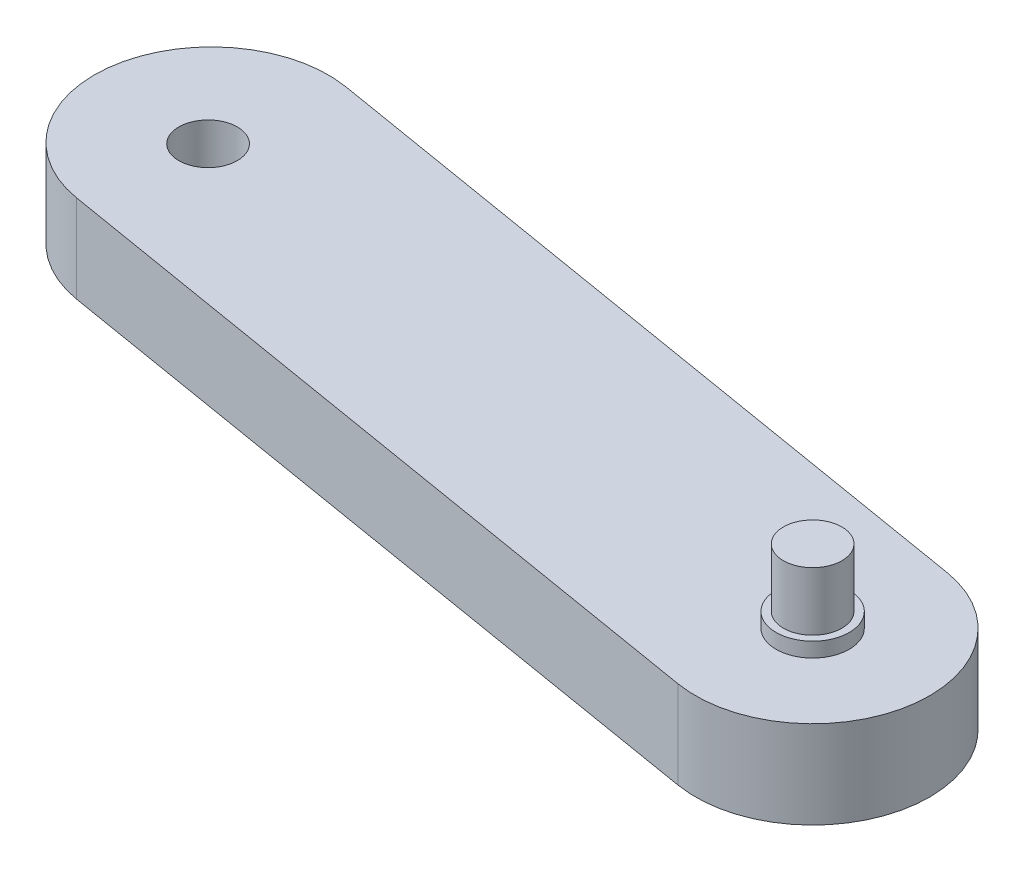
ISO-10303-21;
HEADER;
FILE_DESCRIPTION(('STEP AP214'),'2;1');
FILE_NAME('part.step','',(''),(''),'','','');
FILE_SCHEMA(('AUTOMOTIVE_DESIGN { 1 0 10303 214 1 1 1 1 }'));
ENDSEC;
DATA;
#1=APPLICATION_CONTEXT('core data for automotive mechanical design processes');
#2=APPLICATION_PROTOCOL_DEFINITION('international standard','automotive_design',2000,#1);
#3=PRODUCT_CONTEXT('',#1,'mechanical');
#4=PRODUCT('Part','Part','',(#3));
#5=PRODUCT_RELATED_PRODUCT_CATEGORY('part','',(#4));
#6=PRODUCT_DEFINITION_FORMATION('','',#4);
#7=PRODUCT_DEFINITION_CONTEXT('part definition',#1,'design');
#8=PRODUCT_DEFINITION('design','',#6,#7);
#9=PRODUCT_DEFINITION_SHAPE('','',#8);
#10=(LENGTH_UNIT() NAMED_UNIT(*) SI_UNIT(.MILLI.,.METRE.));
#11=(NAMED_UNIT(*) PLANE_ANGLE_UNIT() SI_UNIT($,.RADIAN.));
#12=(NAMED_UNIT(*) SI_UNIT($,.STERADIAN.) SOLID_ANGLE_UNIT());
#13=UNCERTAINTY_MEASURE_WITH_UNIT(LENGTH_MEASURE(1.E-05),#10,'distance_accuracy_value','');
#14=(GEOMETRIC_REPRESENTATION_CONTEXT(3) GLOBAL_UNCERTAINTY_ASSIGNED_CONTEXT((#13)) GLOBAL_UNIT_ASSIGNED_CONTEXT((#10,
#11,#12)) REPRESENTATION_CONTEXT('',''));
#15=CARTESIAN_POINT('',(0.,0.,0.));
#16=DIRECTION('',(0.,0.,1.));
#17=DIRECTION('',(1.,0.,0.));
#18=AXIS2_PLACEMENT_3D('',#15,#16,#17);
#19=CARTESIAN_POINT('',(49.660593642251,-4.99999999999475,15.1054988992519));
#20=DIRECTION('',(0.,-1.,-8.40308555279392E-13));
#21=DIRECTION('',(0.986423745690054,-1.21441128209191E-13,0.164219955970046));
#22=AXIS2_PLACEMENT_3D('',#19,#20,#21);
#23=CYLINDRICAL_SURFACE('',#22,2.49999999999999);
#24=CARTESIAN_POINT('',(49.6605936422511,-9.99999999999475,15.1054988992477));
#25=DIRECTION('',(0.,-1.,-8.40308555279392E-13));
#26=DIRECTION('',(0.986423745690054,-1.21441128209191E-13,0.164219955970046));
#27=AXIS2_PLACEMENT_3D('',#24,#25,#26);
#28=CIRCLE('',#27,2.49999999999999);
#29=CARTESIAN_POINT('',(52.1266530064762,-9.99999999999506,15.5160487891728));
#30=VERTEX_POINT('',#29);
#31=EDGE_CURVE('E11',#30,#30,#28,.F.);
#32=ORIENTED_EDGE('',*,*,#31,.T.);
#33=EDGE_LOOP('',(#32));
#34=FACE_BOUND('',#33,.T.);
#35=CARTESIAN_POINT('',(49.6605936422511,-8.99999999999475,15.1054988992485));
#36=DIRECTION('',(0.,1.,8.40308555279392E-13));
#37=DIRECTION('',(-0.164219955970046,-8.3168517060016E-13,0.986423745690054));
#38=AXIS2_PLACEMENT_3D('',#35,#36,#37);
#39=CIRCLE('',#38,2.49999999999999);
#40=CARTESIAN_POINT('',(49.250043752326,-8.99999999999683,17.5715582634736));
#41=VERTEX_POINT('',#40);
#42=EDGE_CURVE('E111',#41,#41,#39,.T.);
#43=ORIENTED_EDGE('',*,*,#42,.F.);
#44=EDGE_LOOP('',(#43));
#45=FACE_BOUND('',#44,.T.);
#46=ADVANCED_FACE('F42',(#34,#45),#23,.T.);
#47=CARTESIAN_POINT('',(-0.974353290011899,-15.9999999999953,14.7858910662608));
#48=DIRECTION('',(-0.164219955970046,-8.3168517060016E-13,0.986423745690054));
#49=DIRECTION('',(0.,-1.,-8.40308555279392E-13));
#50=AXIS2_PLACEMENT_3D('',#47,#48,#49);
#51=PLANE('',#50);
#52=DIRECTION('',(0.986423745690054,-1.21441128209191E-13,0.164219955970046));
#53=VECTOR('',#52,1.);
#54=CARTESIAN_POINT('',(-0.974353290011999,-9.99999999999534,14.7858910662658));
#55=LINE('',#54,#53);
#56=CARTESIAN_POINT('',(-0.974353290011999,-9.99999999999534,14.7858910662658));
#57=VERTEX_POINT('',#56);
#58=CARTESIAN_POINT('',(48.3468339944907,-10.0000000000014,22.9968888647681));
#59=VERTEX_POINT('',#58);
#60=EDGE_CURVE('E109',#57,#59,#55,.T.);
#61=ORIENTED_EDGE('',*,*,#60,.F.);
#62=DIRECTION('',(0.,1.,8.40308555279392E-13));
#63=VECTOR('',#62,1.);
#64=CARTESIAN_POINT('',(-0.974353290011899,-15.9999999999953,14.7858910662608));
#65=LINE('',#64,#63);
#66=CARTESIAN_POINT('',(-0.974353290011899,-15.9999999999953,14.7858910662608));
#67=VERTEX_POINT('',#66);
#68=EDGE_CURVE('E51',#67,#57,#65,.T.);
#69=ORIENTED_EDGE('',*,*,#68,.F.);
#70=DIRECTION('',(0.986423745690054,-1.21441128209191E-13,0.164219955970046));
#71=VECTOR('',#70,1.);
#72=CARTESIAN_POINT('',(-0.974353290011899,-15.9999999999953,14.7858910662608));
#73=LINE('',#72,#71);
#74=CARTESIAN_POINT('',(48.3468339944908,-16.0000000000014,22.9968888647631));
#75=VERTEX_POINT('',#74);
#76=EDGE_CURVE('E92',#67,#75,#73,.T.);
#77=ORIENTED_EDGE('',*,*,#76,.T.);
#78=DIRECTION('',(0.,1.,8.40308555279392E-13));
#79=VECTOR('',#78,1.);
#80=CARTESIAN_POINT('',(48.3468339944908,-16.0000000000014,22.9968888647631));
#81=LINE('',#80,#79);
#82=EDGE_CURVE('E59',#75,#59,#81,.T.);
#83=ORIENTED_EDGE('',*,*,#82,.T.);
#84=EDGE_LOOP('',(#61,#69,#77,#83));
#85=FACE_BOUND('',#84,.T.);
#86=ADVANCED_FACE('F44',(#85),#51,.T.);
#87=CARTESIAN_POINT('',(0.339406357748471,-15.9999999999887,6.89450110074033));
#88=DIRECTION('',(0.,1.,8.40308555279392E-13));
#89=DIRECTION('',(-0.986423745690054,1.21441128209191E-13,-0.164219955970046));
#90=AXIS2_PLACEMENT_3D('',#87,#88,#89);
#91=CYLINDRICAL_SURFACE('',#90,8.);
#92=CARTESIAN_POINT('',(0.33940635774837,-9.99999999998868,6.89450110074537));
#93=DIRECTION('',(0.,-1.,-8.40308555279392E-13));
#94=DIRECTION('',(0.986423745690054,-1.21441128209191E-13,0.164219955970046));
#95=AXIS2_PLACEMENT_3D('',#92,#93,#94);
#96=CIRCLE('',#95,8.);
#97=CARTESIAN_POINT('',(1.65316600550874,-9.99999999998203,-0.996888864775062));
#98=VERTEX_POINT('',#97);
#99=EDGE_CURVE('E99',#57,#98,#96,.T.);
#100=ORIENTED_EDGE('',*,*,#99,.T.);
#101=DIRECTION('',(0.,1.,8.40308555279392E-13));
#102=VECTOR('',#101,1.);
#103=CARTESIAN_POINT('',(1.65316600550884,-15.999999999982,-0.9968888647801));
#104=LINE('',#103,#102);
#105=CARTESIAN_POINT('',(1.65316600550884,-15.999999999982,-0.9968888647801));
#106=VERTEX_POINT('',#105);
#107=EDGE_CURVE('E96',#106,#98,#104,.T.);
#108=ORIENTED_EDGE('',*,*,#107,.F.);
#109=CARTESIAN_POINT('',(0.339406357748471,-15.9999999999887,6.89450110074033));
#110=DIRECTION('',(0.,-1.,-8.40308555279392E-13));
#111=DIRECTION('',(0.986423745690054,-1.21441128209191E-13,0.164219955970046));
#112=AXIS2_PLACEMENT_3D('',#109,#110,#111);
#113=CIRCLE('',#112,8.);
#114=EDGE_CURVE('E86',#67,#106,#113,.T.);
#115=ORIENTED_EDGE('',*,*,#114,.F.);
#116=ORIENTED_EDGE('',*,*,#68,.T.);
#117=EDGE_LOOP('',(#100,#108,#115,#116));
#118=FACE_BOUND('',#117,.T.);
#119=ADVANCED_FACE('F97',(#118),#91,.T.);
#120=CARTESIAN_POINT('',(1.65316600550884,-15.999999999982,-0.9968888647801));
#121=DIRECTION('',(-0.164219955970046,-8.3168517060016E-13,0.986423745690054));
#122=DIRECTION('',(0.,-1.,-8.40308555279392E-13));
#123=AXIS2_PLACEMENT_3D('',#120,#121,#122);
#124=PLANE('',#123);
#125=DIRECTION('',(0.986423745690054,-1.21441128209191E-13,0.164219955970046));
#126=VECTOR('',#125,1.);
#127=CARTESIAN_POINT('',(1.65316600550874,-9.99999999998203,-0.996888864775062));
#128=LINE('',#127,#126);
#129=CARTESIAN_POINT('',(50.9743532900115,-9.9999999999881,7.21410893372725));
#130=VERTEX_POINT('',#129);
#131=EDGE_CURVE('E113',#98,#130,#128,.T.);
#132=ORIENTED_EDGE('',*,*,#131,.T.);
#133=DIRECTION('',(0.,1.,8.40308555279392E-13));
#134=VECTOR('',#133,1.);
#135=CARTESIAN_POINT('',(50.9743532900116,-15.9999999999881,7.2141089337222));
#136=LINE('',#135,#134);
#137=CARTESIAN_POINT('',(50.9743532900116,-15.9999999999881,7.2141089337222));
#138=VERTEX_POINT('',#137);
#139=EDGE_CURVE('E74',#138,#130,#136,.T.);
#140=ORIENTED_EDGE('',*,*,#139,.F.);
#141=DIRECTION('',(0.986423745690054,-1.21441128209191E-13,0.164219955970046));
#142=VECTOR('',#141,1.);
#143=CARTESIAN_POINT('',(1.65316600550884,-15.999999999982,-0.9968888647801));
#144=LINE('',#143,#142);
#145=EDGE_CURVE('E91',#106,#138,#144,.T.);
#146=ORIENTED_EDGE('',*,*,#145,.F.);
#147=ORIENTED_EDGE('',*,*,#107,.T.);
#148=EDGE_LOOP('',(#132,#140,#146,#147));
#149=FACE_BOUND('',#148,.T.);
#150=ADVANCED_FACE('F103',(#149),#124,.F.);
#151=CARTESIAN_POINT('',(49.6605936422512,-15.9999999999948,15.1054988992426));
#152=DIRECTION('',(0.,1.,8.40308555279392E-13));
#153=DIRECTION('',(-0.986423745690054,1.21441128209191E-13,-0.164219955970046));
#154=AXIS2_PLACEMENT_3D('',#151,#152,#153);
#155=CYLINDRICAL_SURFACE('',#154,8.);
#156=CARTESIAN_POINT('',(49.6605936422511,-9.99999999999475,15.1054988992477));
#157=DIRECTION('',(0.,-1.,-8.40308555279392E-13));
#158=DIRECTION('',(0.986423745690054,-1.21441128209191E-13,0.164219955970046));
#159=AXIS2_PLACEMENT_3D('',#156,#157,#158);
#160=CIRCLE('',#159,8.);
#161=EDGE_CURVE('E115',#59,#130,#160,.F.);
#162=ORIENTED_EDGE('',*,*,#161,.F.);
#163=ORIENTED_EDGE('',*,*,#82,.F.);
#164=CARTESIAN_POINT('',(49.6605936422512,-15.9999999999948,15.1054988992426));
#165=DIRECTION('',(0.,-1.,-8.40308555279392E-13));
#166=DIRECTION('',(0.986423745690054,-1.21441128209191E-13,0.164219955970046));
#167=AXIS2_PLACEMENT_3D('',#164,#165,#166);
#168=CIRCLE('',#167,8.);
#169=EDGE_CURVE('E104',#75,#138,#168,.F.);
#170=ORIENTED_EDGE('',*,*,#169,.T.);
#171=ORIENTED_EDGE('',*,*,#139,.T.);
#172=EDGE_LOOP('',(#162,#163,#170,#171));
#173=FACE_BOUND('',#172,.T.);
#174=ADVANCED_FACE('F137',(#173),#155,.T.);
#175=CARTESIAN_POINT('',(0.339406357748471,-15.9999999999887,6.89450110074033));
#176=DIRECTION('',(0.,-1.,-8.40308555279392E-13));
#177=DIRECTION('',(0.986423745690054,-1.21441128209191E-13,0.164219955970046));
#178=AXIS2_PLACEMENT_3D('',#175,#176,#177);
#179=PLANE('',#178);
#180=CARTESIAN_POINT('',(0.307919561144055,-15.9999999999888,7.08832981948345));
#181=DIRECTION('',(0.,-1.,-8.40308555279392E-13));
#182=DIRECTION('',(0.156466807220186,8.32613400229528E-13,-0.987683217554253));
#183=AXIS2_PLACEMENT_3D('',#180,#181,#182);
#184=CIRCLE('',#183,2.);
#185=CARTESIAN_POINT('',(0.620853175584427,-15.9999999999872,5.11296338437494));
#186=VERTEX_POINT('',#185);
#187=EDGE_CURVE('E223',#186,#186,#184,.T.);
#188=ORIENTED_EDGE('',*,*,#187,.F.);
#189=EDGE_LOOP('',(#188));
#190=FACE_BOUND('',#189,.T.);
#191=ORIENTED_EDGE('',*,*,#76,.F.);
#192=ORIENTED_EDGE('',*,*,#114,.T.);
#193=ORIENTED_EDGE('',*,*,#145,.T.);
#194=ORIENTED_EDGE('',*,*,#169,.F.);
#195=EDGE_LOOP('',(#191,#192,#193,#194));
#196=FACE_BOUND('',#195,.T.);
#197=ADVANCED_FACE('F88',(#190,#196),#179,.T.);
#198=CARTESIAN_POINT('',(0.33940635774837,-9.99999999998868,6.89450110074537));
#199=DIRECTION('',(0.,-1.,-8.40308555279392E-13));
#200=DIRECTION('',(0.986423745690054,-1.21441128209191E-13,0.164219955970046));
#201=AXIS2_PLACEMENT_3D('',#198,#199,#200);
#202=PLANE('',#201);
#203=CARTESIAN_POINT('',(0.307919561144575,-9.99999999998867,7.08832981948426));
#204=DIRECTION('',(0.,1.,1.36466768165755E-13));
#205=DIRECTION('',(-0.156466807220186,-1.2127470187412E-13,0.987683217554253));
#206=AXIS2_PLACEMENT_3D('',#203,#204,#205);
#207=CIRCLE('',#206,2.);
#208=CARTESIAN_POINT('',(-0.0050140532957971,-9.99999999998891,9.06369625459277));
#209=VERTEX_POINT('',#208);
#210=EDGE_CURVE('E226',#209,#209,#207,.T.);
#211=ORIENTED_EDGE('',*,*,#210,.F.);
#212=EDGE_LOOP('',(#211));
#213=FACE_BOUND('',#212,.T.);
#214=ORIENTED_EDGE('',*,*,#31,.F.);
#215=EDGE_LOOP('',(#214));
#216=FACE_BOUND('',#215,.T.);
#217=ORIENTED_EDGE('',*,*,#60,.T.);
#218=ORIENTED_EDGE('',*,*,#161,.T.);
#219=ORIENTED_EDGE('',*,*,#131,.F.);
#220=ORIENTED_EDGE('',*,*,#99,.F.);
#221=EDGE_LOOP('',(#217,#218,#219,#220));
#222=FACE_BOUND('',#221,.T.);
#223=ADVANCED_FACE('F120',(#213,#216,#222),#202,.F.);
#224=CARTESIAN_POINT('',(49.6605936422511,-8.99999999999475,15.1054988992485));
#225=DIRECTION('',(0.,1.,8.40308555279392E-13));
#226=DIRECTION('',(-0.164219955970046,-8.3168517060016E-13,0.986423745690054));
#227=AXIS2_PLACEMENT_3D('',#224,#225,#226);
#228=PLANE('',#227);
#229=CARTESIAN_POINT('',(49.6605936422511,-8.99999999999475,15.1054988992485));
#230=DIRECTION('',(0.,1.,8.40308555279392E-13));
#231=DIRECTION('',(-0.164219955970046,-8.3168517060016E-13,0.986423745690054));
#232=AXIS2_PLACEMENT_3D('',#229,#230,#231);
#233=CIRCLE('',#232,2.);
#234=CARTESIAN_POINT('',(49.332153730311,-8.99999999999641,17.0783463906286));
#235=VERTEX_POINT('',#234);
#236=EDGE_CURVE('E231',#235,#235,#233,.T.);
#237=ORIENTED_EDGE('',*,*,#236,.F.);
#238=EDGE_LOOP('',(#237));
#239=FACE_BOUND('',#238,.T.);
#240=ORIENTED_EDGE('',*,*,#42,.T.);
#241=EDGE_LOOP('',(#240));
#242=FACE_BOUND('',#241,.T.);
#243=ADVANCED_FACE('F141',(#239,#242),#228,.T.);
#244=CARTESIAN_POINT('',(49.6605936422511,-8.99999999999475,15.1054988992485));
#245=DIRECTION('',(0.,1.,8.40308555279392E-13));
#246=DIRECTION('',(-0.164219955970046,-8.3168517060016E-13,0.986423745690054));
#247=AXIS2_PLACEMENT_3D('',#244,#245,#246);
#248=CYLINDRICAL_SURFACE('',#247,2.);
#249=ORIENTED_EDGE('',*,*,#236,.T.);
#250=EDGE_LOOP('',(#249));
#251=FACE_BOUND('',#250,.T.);
#252=CARTESIAN_POINT('',(49.660593642251,-4.99999999999475,15.1054988992519));
#253=DIRECTION('',(0.,1.,8.40308555279392E-13));
#254=DIRECTION('',(-0.164219955970046,-8.3168517060016E-13,0.986423745690054));
#255=AXIS2_PLACEMENT_3D('',#252,#253,#254);
#256=CIRCLE('',#255,2.);
#257=CARTESIAN_POINT('',(49.3321537303109,-4.99999999999642,17.078346390632));
#258=VERTEX_POINT('',#257);
#259=EDGE_CURVE('E228',#258,#258,#256,.T.);
#260=ORIENTED_EDGE('',*,*,#259,.F.);
#261=EDGE_LOOP('',(#260));
#262=FACE_BOUND('',#261,.T.);
#263=ADVANCED_FACE('F168',(#251,#262),#248,.T.);
#264=CARTESIAN_POINT('',(49.660593642251,-4.99999999999475,15.1054988992519));
#265=DIRECTION('',(0.,1.,8.40308555279392E-13));
#266=DIRECTION('',(-0.986423745690054,1.21441128209191E-13,-0.164219955970046));
#267=AXIS2_PLACEMENT_3D('',#264,#265,#266);
#268=PLANE('',#267);
#269=ORIENTED_EDGE('',*,*,#259,.T.);
#270=EDGE_LOOP('',(#269));
#271=FACE_BOUND('',#270,.T.);
#272=ADVANCED_FACE('F133',(#271),#268,.T.);
#273=CARTESIAN_POINT('',(0.307919561143709,-19.9999999999887,7.0883298194829));
#274=DIRECTION('',(0.,1.,1.36466768165755E-13));
#275=DIRECTION('',(-0.156466807220186,-1.2127470187412E-13,0.987683217554253));
#276=AXIS2_PLACEMENT_3D('',#273,#274,#275);
#277=CYLINDRICAL_SURFACE('',#276,2.);
#278=ORIENTED_EDGE('',*,*,#187,.T.);
#279=EDGE_LOOP('',(#278));
#280=FACE_BOUND('',#279,.T.);
#281=ORIENTED_EDGE('',*,*,#210,.T.);
#282=EDGE_LOOP('',(#281));
#283=FACE_BOUND('',#282,.T.);
#284=ADVANCED_FACE('F182',(#280,#283),#277,.F.);
#285=CLOSED_SHELL('',(#46,#86,#119,#150,#174,#197,#223,#243,#263,#272,#284));
#286=MANIFOLD_SOLID_BREP('B2',#285);
#287=ADVANCED_BREP_SHAPE_REPRESENTATION('',(#18,#286),#14);
#288=SHAPE_DEFINITION_REPRESENTATION(#9,#287);
ENDSEC;
END-ISO-10303-21;
